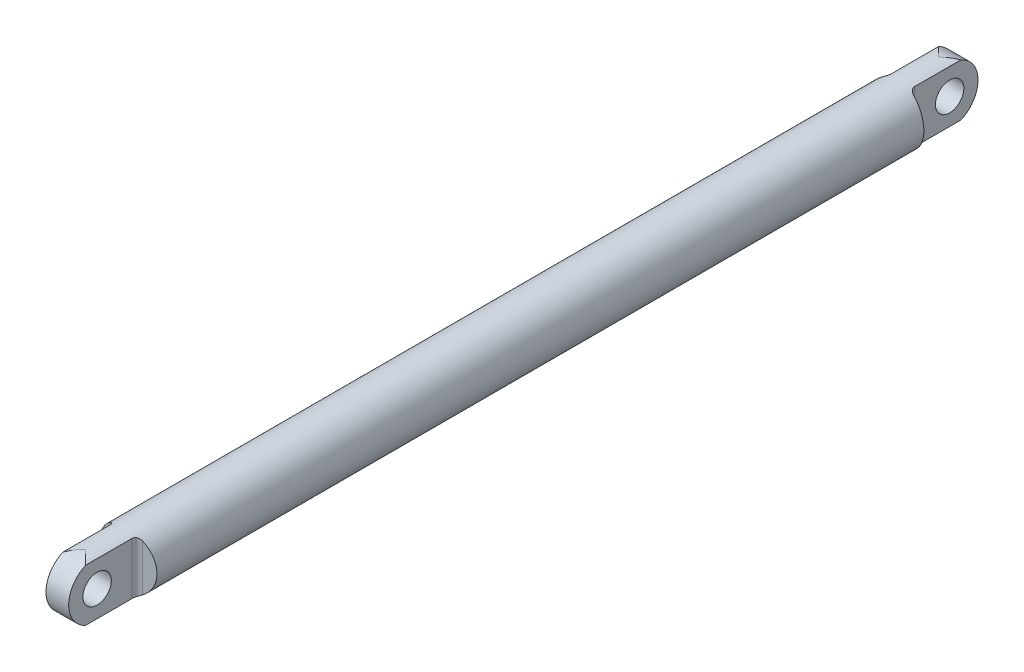
ISO-10303-21;
HEADER;
FILE_DESCRIPTION(('STEP AP214'),'2;1');
FILE_NAME('part.step','',(''),(''),'','','');
FILE_SCHEMA(('AUTOMOTIVE_DESIGN { 1 0 10303 214 1 1 1 1 }'));
ENDSEC;
DATA;
#1=APPLICATION_CONTEXT('core data for automotive mechanical design processes');
#2=APPLICATION_PROTOCOL_DEFINITION('international standard','automotive_design',2000,#1);
#3=PRODUCT_CONTEXT('',#1,'mechanical');
#4=PRODUCT('Part','Part','',(#3));
#5=PRODUCT_RELATED_PRODUCT_CATEGORY('part','',(#4));
#6=PRODUCT_DEFINITION_FORMATION('','',#4);
#7=PRODUCT_DEFINITION_CONTEXT('part definition',#1,'design');
#8=PRODUCT_DEFINITION('design','',#6,#7);
#9=PRODUCT_DEFINITION_SHAPE('','',#8);
#10=(LENGTH_UNIT() NAMED_UNIT(*) SI_UNIT(.MILLI.,.METRE.));
#11=(NAMED_UNIT(*) PLANE_ANGLE_UNIT() SI_UNIT($,.RADIAN.));
#12=(NAMED_UNIT(*) SI_UNIT($,.STERADIAN.) SOLID_ANGLE_UNIT());
#13=UNCERTAINTY_MEASURE_WITH_UNIT(LENGTH_MEASURE(1.E-05),#10,'distance_accuracy_value','');
#14=(GEOMETRIC_REPRESENTATION_CONTEXT(3) GLOBAL_UNCERTAINTY_ASSIGNED_CONTEXT((#13)) GLOBAL_UNIT_ASSIGNED_CONTEXT((#10,
#11,#12)) REPRESENTATION_CONTEXT('',''));
#15=CARTESIAN_POINT('',(0.,0.,0.));
#16=DIRECTION('',(0.,0.,1.));
#17=DIRECTION('',(1.,0.,0.));
#18=AXIS2_PLACEMENT_3D('',#15,#16,#17);
#19=CARTESIAN_POINT('',(0.,0.,80.));
#20=DIRECTION('',(0.,0.,-1.));
#21=DIRECTION('',(-1.,0.,0.));
#22=AXIS2_PLACEMENT_3D('',#19,#20,#21);
#23=CYLINDRICAL_SURFACE('',#22,5.);
#24=CARTESIAN_POINT('',(0.,0.,-75.));
#25=DIRECTION('',(0.707106781186547,0.,-0.707106781186547));
#26=DIRECTION('',(-0.707106781186547,0.,-0.707106781186547));
#27=AXIS2_PLACEMENT_3D('',#24,#25,#26);
#28=ELLIPSE('',#27,7.07106781186548,5.);
#29=CARTESIAN_POINT('',(-2.00000000000001,4.58257569495584,-77.));
#30=VERTEX_POINT('',#29);
#31=CARTESIAN_POINT('',(0.,5.,-75.));
#32=VERTEX_POINT('',#31);
#33=EDGE_CURVE('E262',#30,#32,#28,.T.);
#34=ORIENTED_EDGE('',*,*,#33,.F.);
#35=DIRECTION('',(0.,0.,-1.));
#36=VECTOR('',#35,1.);
#37=CARTESIAN_POINT('',(-1.99999999999999,4.58257569495584,80.));
#38=LINE('',#37,#36);
#39=CARTESIAN_POINT('',(-1.99999999999999,4.58257569495584,-68.8390996311773));
#40=VERTEX_POINT('',#39);
#41=EDGE_CURVE('E253',#30,#40,#38,.F.);
#42=ORIENTED_EDGE('',*,*,#41,.T.);
#43=CARTESIAN_POINT('',(-2.00000000000001,4.58257569495584,-68.8390996311773));
#44=CARTESIAN_POINT('',(-1.99999915444129,4.58257472593018,-68.8129276777542));
#45=CARTESIAN_POINT('',(-2.00102821839981,4.58212708763721,-68.7867686087725));
#46=CARTESIAN_POINT('',(-2.0051266653071,4.58033562986356,-68.7346452838835));
#47=CARTESIAN_POINT('',(-2.00819576753023,4.57899193368756,-68.7086810016689));
#48=CARTESIAN_POINT('',(-2.02040918663705,4.57362335833865,-68.6314818548721));
#49=CARTESIAN_POINT('',(-2.03255988752701,4.56826100508697,-68.5807774510349));
#50=CARTESIAN_POINT('',(-2.06436900142487,4.55397412004701,-68.4823442983605));
#51=CARTESIAN_POINT('',(-2.08402797152572,4.54504932393306,-68.4346157706309));
#52=CARTESIAN_POINT('',(-2.13003060073107,4.52367221490259,-68.3433539562937));
#53=CARTESIAN_POINT('',(-2.15637506815071,4.5112194754162,-68.2998211778551));
#54=CARTESIAN_POINT('',(-2.21528854875706,4.48258714434022,-68.2171193976618));
#55=CARTESIAN_POINT('',(-2.24797505017513,4.46633578752553,-68.1780592935543));
#56=CARTESIAN_POINT('',(-2.31792519070582,4.43043637934986,-68.1060962528812));
#57=CARTESIAN_POINT('',(-2.3551900538286,4.41078741907608,-68.0731949688152));
#58=CARTESIAN_POINT('',(-2.4357720729094,4.36683706502207,-68.0118188589375));
#59=CARTESIAN_POINT('',(-2.47933164249846,4.34230300420189,-67.9838310543528));
#60=CARTESIAN_POINT('',(-2.56870332519188,4.29003983926384,-67.9354587212927));
#61=CARTESIAN_POINT('',(-2.61451640275604,4.26230936019635,-67.9150774809005));
#62=CARTESIAN_POINT('',(-2.68823377653695,4.21597625768681,-67.8884913835967));
#63=CARTESIAN_POINT('',(-2.71585318767789,4.19824162500067,-67.8798909952264));
#64=CARTESIAN_POINT('',(-2.7711147835996,4.16197263460167,-67.86522830102));
#65=CARTESIAN_POINT('',(-2.79875663714262,4.14344090397121,-67.8591582712572));
#66=CARTESIAN_POINT('',(-2.82635182233292,4.12452850352564,-67.8542918781645));
#67=B_SPLINE_CURVE_WITH_KNOTS('',3,(#43,#44,#45,#46,#47,#48,#49,#50,#51,#52,#53,#54,#55,#56,#57,
#58,#59,#60,#61,#62,#63,#64,#65,#66),.UNSPECIFIED.,.F.,.F.,(4,2,2,2,2,2,2,2,2,2,2,4),(0.,
0.0784663817379444,0.156921968106402,0.313349821180226,0.469789283026269,0.626247668323181,
0.785942562576915,0.945680244027676,1.1168798895503,1.28815345391952,1.38985263002429,
1.49123905476497),.UNSPECIFIED.);
#68=CARTESIAN_POINT('',(-2.82635182233307,4.12452850352552,-67.8542918781651));
#69=VERTEX_POINT('',#68);
#70=EDGE_CURVE('E290',#40,#69,#67,.T.);
#71=ORIENTED_EDGE('',*,*,#70,.T.);
#72=CARTESIAN_POINT('',(0.,0.,-68.3526539614169));
#73=DIRECTION('',(0.173648177666934,0.,0.984807753012207));
#74=DIRECTION('',(0.984807753012208,0.,-0.173648177666934));
#75=AXIS2_PLACEMENT_3D('',#72,#73,#74);
#76=ELLIPSE('',#75,5.07713305942873,5.);
#77=CARTESIAN_POINT('',(-2.82635182233307,-4.12452850352553,-67.8542918781651));
#78=VERTEX_POINT('',#77);
#79=EDGE_CURVE('E275',#69,#78,#76,.T.);
#80=ORIENTED_EDGE('',*,*,#79,.T.);
#81=CARTESIAN_POINT('',(-2.82635182233307,-4.12452850352553,-67.8542918781651));
#82=CARTESIAN_POINT('',(-2.79872879714416,-4.14345911096438,-67.8591648493181));
#83=CARTESIAN_POINT('',(-2.77106472198215,-4.16200578901324,-67.8652400496295));
#84=CARTESIAN_POINT('',(-2.71582131156839,-4.19826224817888,-67.8799009977672));
#85=CARTESIAN_POINT('',(-2.68824206549188,-4.21597132333363,-67.8884888210149));
#86=CARTESIAN_POINT('',(-2.60562708818359,-4.26789594594826,-67.9182825523776));
#87=CARTESIAN_POINT('',(-2.55104537825535,-4.30068290114259,-67.9434636570296));
#88=CARTESIAN_POINT('',(-2.44518753710328,-4.3617449826476,-68.0048651632682));
#89=CARTESIAN_POINT('',(-2.393929894614,-4.38999598168069,-68.0411417977512));
#90=CARTESIAN_POINT('',(-2.29786494174254,-4.44103234033674,-68.1242457218313));
#91=CARTESIAN_POINT('',(-2.25303543143821,-4.46383670128808,-68.1710351931477));
#92=CARTESIAN_POINT('',(-2.17769218201057,-4.50102156871438,-68.2672223130545));
#93=CARTESIAN_POINT('',(-2.14607348315317,-4.51611322224303,-68.3154815697644));
#94=CARTESIAN_POINT('',(-2.09126763923946,-4.54175298426806,-68.4177131001897));
#95=CARTESIAN_POINT('',(-2.06808261529536,-4.55229994987521,-68.4716868067176));
#96=CARTESIAN_POINT('',(-2.03342083181656,-4.567879519199,-68.5774243148847));
#97=CARTESIAN_POINT('',(-2.02094462620011,-4.57338725489439,-68.6287895889348));
#98=CARTESIAN_POINT('',(-2.00840913218152,-4.57889846732529,-68.7070040721295));
#99=CARTESIAN_POINT('',(-2.00526038880634,-4.58027713736905,-68.7332975468325));
#100=CARTESIAN_POINT('',(-2.00105489328033,-4.58211544653102,-68.786089733559));
#101=CARTESIAN_POINT('',(-1.99999866322062,-4.5825748562901,-68.8125884951472));
#102=CARTESIAN_POINT('',(-2.00000000000001,-4.58257569495584,-68.8390996311773));
#103=B_SPLINE_CURVE_WITH_KNOTS('',3,(#81,#82,#83,#84,#85,#86,#87,#88,#89,#90,#91,#92,#93,#94,
#95,#96,#97,#98,#99,#100,#101,#102),.UNSPECIFIED.,.F.,.F.,(4,2,2,2,2,2,2,2,2,2,4),(0.,
0.101474679839068,0.203033415339603,0.407351201337666,0.612722140973029,0.817365794656781,
0.995287046442571,1.17325301544067,1.33185526554502,1.411319462848,1.49080348431638),.UNSPECIFIED.);
#104=CARTESIAN_POINT('',(-1.99999999999999,-4.58257569495584,-68.8390996311773));
#105=VERTEX_POINT('',#104);
#106=EDGE_CURVE('E297',#78,#105,#103,.T.);
#107=ORIENTED_EDGE('',*,*,#106,.T.);
#108=DIRECTION('',(0.,0.,-1.));
#109=VECTOR('',#108,1.);
#110=CARTESIAN_POINT('',(-1.99999999999999,-4.58257569495584,80.));
#111=LINE('',#110,#109);
#112=CARTESIAN_POINT('',(-2.00000000000001,-4.58257569495584,-77.));
#113=VERTEX_POINT('',#112);
#114=EDGE_CURVE('E256',#105,#113,#111,.T.);
#115=ORIENTED_EDGE('',*,*,#114,.T.);
#116=CARTESIAN_POINT('',(0.,-5.,-75.));
#117=VERTEX_POINT('',#116);
#118=EDGE_CURVE('E263',#117,#113,#28,.T.);
#119=ORIENTED_EDGE('',*,*,#118,.F.);
#120=CARTESIAN_POINT('',(0.,0.,-75.));
#121=DIRECTION('',(-0.707106781186547,0.,-0.707106781186547));
#122=DIRECTION('',(0.707106781186547,0.,-0.707106781186547));
#123=AXIS2_PLACEMENT_3D('',#120,#121,#122);
#124=ELLIPSE('',#123,7.07106781186548,5.);
#125=CARTESIAN_POINT('',(1.99999999999999,-4.58257569495584,-77.));
#126=VERTEX_POINT('',#125);
#127=EDGE_CURVE('E258',#126,#117,#124,.T.);
#128=ORIENTED_EDGE('',*,*,#127,.F.);
#129=DIRECTION('',(0.,0.,-1.));
#130=VECTOR('',#129,1.);
#131=CARTESIAN_POINT('',(2.,-4.58257569495584,80.));
#132=LINE('',#131,#130);
#133=CARTESIAN_POINT('',(2.,-4.58257569495584,-68.8390996311773));
#134=VERTEX_POINT('',#133);
#135=EDGE_CURVE('E248',#126,#134,#132,.F.);
#136=ORIENTED_EDGE('',*,*,#135,.T.);
#137=CARTESIAN_POINT('',(1.99999999999999,-4.58257569495584,-68.8390996311773));
#138=CARTESIAN_POINT('',(1.99999915444127,-4.58257472593018,-68.8129276777542));
#139=CARTESIAN_POINT('',(2.00102821839979,-4.58212708763722,-68.7867686087726));
#140=CARTESIAN_POINT('',(2.00512666530709,-4.58033562986357,-68.7346452838835));
#141=CARTESIAN_POINT('',(2.00819576753022,-4.57899193368756,-68.7086810016689));
#142=CARTESIAN_POINT('',(2.02040918663704,-4.57362335833865,-68.6314818548721));
#143=CARTESIAN_POINT('',(2.03255988752699,-4.56826100508697,-68.5807774510349));
#144=CARTESIAN_POINT('',(2.06436900142486,-4.55397412004702,-68.4823442983605));
#145=CARTESIAN_POINT('',(2.08402797152571,-4.54504932393306,-68.4346157706309));
#146=CARTESIAN_POINT('',(2.13003060073106,-4.52367221490259,-68.3433539562937));
#147=CARTESIAN_POINT('',(2.1563750681507,-4.51121947541621,-68.2998211778551));
#148=CARTESIAN_POINT('',(2.21528854875704,-4.48258714434023,-68.2171193976618));
#149=CARTESIAN_POINT('',(2.24797505017512,-4.46633578752553,-68.1780592935543));
#150=CARTESIAN_POINT('',(2.31792519070581,-4.43043637934986,-68.1060962528813));
#151=CARTESIAN_POINT('',(2.35519005382859,-4.41078741907609,-68.0731949688152));
#152=CARTESIAN_POINT('',(2.43577207290938,-4.36683706502208,-68.0118188589376));
#153=CARTESIAN_POINT('',(2.47933164249844,-4.34230300420189,-67.9838310543528));
#154=CARTESIAN_POINT('',(2.56870332519187,-4.29003983926385,-67.9354587212927));
#155=CARTESIAN_POINT('',(2.61451640275603,-4.26230936019636,-67.9150774809005));
#156=CARTESIAN_POINT('',(2.68823377653694,-4.21597625768682,-67.8884913835967));
#157=CARTESIAN_POINT('',(2.71585318767788,-4.19824162500067,-67.8798909952264));
#158=CARTESIAN_POINT('',(2.77111478359959,-4.16197263460168,-67.86522830102));
#159=CARTESIAN_POINT('',(2.79875663714262,-4.14344090397122,-67.8591582712572));
#160=CARTESIAN_POINT('',(2.82635182233292,-4.12452850352564,-67.8542918781645));
#161=B_SPLINE_CURVE_WITH_KNOTS('',3,(#137,#138,#139,#140,#141,#142,#143,#144,#145,#146,#147,
#148,#149,#150,#151,#152,#153,#154,#155,#156,#157,#158,#159,#160),.UNSPECIFIED.,.F.,.F.,(4,2,2,
2,2,2,2,2,2,2,2,4),(0.,0.0784663817379581,0.156921968106416,0.313349821180226,0.469789283026285,
0.626247668323181,0.785942562576919,0.945680244027675,1.11687988955031,1.28815345391951,
1.3898526300243,1.49123905476499),.UNSPECIFIED.);
#162=CARTESIAN_POINT('',(2.82635182233308,-4.12452850352553,-67.8542918781651));
#163=VERTEX_POINT('',#162);
#164=EDGE_CURVE('E225',#134,#163,#161,.T.);
#165=ORIENTED_EDGE('',*,*,#164,.T.);
#166=CARTESIAN_POINT('',(0.,0.,-68.3526539614169));
#167=DIRECTION('',(-0.173648177666915,0.,0.984807753012211));
#168=DIRECTION('',(-0.984807753012211,0.,-0.173648177666915));
#169=AXIS2_PLACEMENT_3D('',#166,#167,#168);
#170=ELLIPSE('',#169,5.07713305942871,5.);
#171=CARTESIAN_POINT('',(2.82635182233308,4.12452850352553,-67.8542918781651));
#172=VERTEX_POINT('',#171);
#173=EDGE_CURVE('E272',#163,#172,#170,.T.);
#174=ORIENTED_EDGE('',*,*,#173,.T.);
#175=CARTESIAN_POINT('',(2.82635182233307,4.12452850352553,-67.8542918781651));
#176=CARTESIAN_POINT('',(2.79872879714416,4.14345911096438,-67.8591648493181));
#177=CARTESIAN_POINT('',(2.77106472198215,4.16200578901324,-67.8652400496295));
#178=CARTESIAN_POINT('',(2.71582131156839,4.19826224817888,-67.8799009977672));
#179=CARTESIAN_POINT('',(2.68824206549188,4.21597132333363,-67.8884888210149));
#180=CARTESIAN_POINT('',(2.6056270881836,4.26789594594826,-67.9182825523776));
#181=CARTESIAN_POINT('',(2.55104537825535,4.3006829011426,-67.9434636570296));
#182=CARTESIAN_POINT('',(2.44518753710328,4.36174498264761,-68.0048651632682));
#183=CARTESIAN_POINT('',(2.39392989461399,4.38999598168069,-68.0411417977512));
#184=CARTESIAN_POINT('',(2.29786494174253,4.44103234033675,-68.1242457218313));
#185=CARTESIAN_POINT('',(2.2530354314382,4.46383670128808,-68.1710351931477));
#186=CARTESIAN_POINT('',(2.17769218201056,4.50102156871439,-68.2672223130545));
#187=CARTESIAN_POINT('',(2.14607348315315,4.51611322224304,-68.3154815697644));
#188=CARTESIAN_POINT('',(2.09126763923944,4.54175298426807,-68.4177131001897));
#189=CARTESIAN_POINT('',(2.06808261529534,4.55229994987522,-68.4716868067176));
#190=CARTESIAN_POINT('',(2.03342083181654,4.567879519199,-68.5774243148847));
#191=CARTESIAN_POINT('',(2.02094462620009,4.5733872548944,-68.6287895889348));
#192=CARTESIAN_POINT('',(2.00840913218151,4.5788984673253,-68.7070040721295));
#193=CARTESIAN_POINT('',(2.00526038880633,4.58027713736906,-68.7332975468326));
#194=CARTESIAN_POINT('',(2.00105489328031,4.58211544653103,-68.786089733559));
#195=CARTESIAN_POINT('',(1.9999986632206,4.58257485629011,-68.8125884951472));
#196=CARTESIAN_POINT('',(1.99999999999999,4.58257569495584,-68.8390996311773));
#197=B_SPLINE_CURVE_WITH_KNOTS('',3,(#175,#176,#177,#178,#179,#180,#181,#182,#183,#184,#185,
#186,#187,#188,#189,#190,#191,#192,#193,#194,#195,#196),.UNSPECIFIED.,.F.,.F.,(4,2,2,2,2,2,2,2,
2,2,4),(0.,0.101474679839068,0.203033415339603,0.407351201337675,0.61272214097303,
0.8173657946568,0.99528704644259,1.17325301544069,1.33185526554504,1.41131946284802,
1.4908034843164),.UNSPECIFIED.);
#198=CARTESIAN_POINT('',(2.,4.58257569495584,-68.8390996311773));
#199=VERTEX_POINT('',#198);
#200=EDGE_CURVE('E320',#172,#199,#197,.T.);
#201=ORIENTED_EDGE('',*,*,#200,.T.);
#202=DIRECTION('',(0.,0.,-1.));
#203=VECTOR('',#202,1.);
#204=CARTESIAN_POINT('',(2.,4.58257569495584,80.));
#205=LINE('',#204,#203);
#206=CARTESIAN_POINT('',(1.99999999999999,4.58257569495584,-77.));
#207=VERTEX_POINT('',#206);
#208=EDGE_CURVE('E251',#199,#207,#205,.T.);
#209=ORIENTED_EDGE('',*,*,#208,.T.);
#210=EDGE_CURVE('E259',#32,#207,#124,.T.);
#211=ORIENTED_EDGE('',*,*,#210,.F.);
#212=EDGE_LOOP('',(#34,#42,#71,#80,#107,#115,#119,#128,#136,#165,#174,#201,#209,#211));
#213=FACE_BOUND('',#212,.T.);
#214=CARTESIAN_POINT('',(0.,0.,68.3526539614169));
#215=DIRECTION('',(-0.173648177666934,0.,0.984807753012207));
#216=DIRECTION('',(-0.984807753012208,0.,-0.173648177666934));
#217=AXIS2_PLACEMENT_3D('',#214,#215,#216);
#218=ELLIPSE('',#217,5.07713305942873,5.);
#219=CARTESIAN_POINT('',(-2.82635182233307,4.12452850352553,67.8542918781651));
#220=VERTEX_POINT('',#219);
#221=CARTESIAN_POINT('',(-2.82635182233307,-4.12452850352552,67.8542918781651));
#222=VERTEX_POINT('',#221);
#223=EDGE_CURVE('E334',#220,#222,#218,.T.);
#224=ORIENTED_EDGE('',*,*,#223,.F.);
#225=CARTESIAN_POINT('',(-2.82635182233307,4.12452850352553,67.8542918781651));
#226=CARTESIAN_POINT('',(-2.79872879714416,4.14345911096438,67.8591648493181));
#227=CARTESIAN_POINT('',(-2.77106472198215,4.16200578901324,67.8652400496295));
#228=CARTESIAN_POINT('',(-2.71582131156839,4.19826224817888,67.8799009977672));
#229=CARTESIAN_POINT('',(-2.68824206549188,4.21597132333363,67.8884888210149));
#230=CARTESIAN_POINT('',(-2.60562708818359,4.26789594594826,67.9182825523776));
#231=CARTESIAN_POINT('',(-2.55104537825535,4.30068290114259,67.9434636570296));
#232=CARTESIAN_POINT('',(-2.44518753710328,4.3617449826476,68.0048651632682));
#233=CARTESIAN_POINT('',(-2.393929894614,4.38999598168069,68.0411417977512));
#234=CARTESIAN_POINT('',(-2.29786494174254,4.44103234033674,68.1242457218313));
#235=CARTESIAN_POINT('',(-2.25303543143821,4.46383670128808,68.1710351931477));
#236=CARTESIAN_POINT('',(-2.17769218201057,4.50102156871438,68.2672223130545));
#237=CARTESIAN_POINT('',(-2.14607348315317,4.51611322224303,68.3154815697644));
#238=CARTESIAN_POINT('',(-2.09126763923946,4.54175298426806,68.4177131001897));
#239=CARTESIAN_POINT('',(-2.06808261529536,4.55229994987521,68.4716868067176));
#240=CARTESIAN_POINT('',(-2.03342083181656,4.567879519199,68.5774243148847));
#241=CARTESIAN_POINT('',(-2.02094462620011,4.57338725489439,68.6287895889348));
#242=CARTESIAN_POINT('',(-2.00840913218152,4.57889846732529,68.7070040721295));
#243=CARTESIAN_POINT('',(-2.00526038880634,4.58027713736905,68.7332975468325));
#244=CARTESIAN_POINT('',(-2.00105489328033,4.58211544653102,68.786089733559));
#245=CARTESIAN_POINT('',(-1.99999866322062,4.5825748562901,68.8125884951472));
#246=CARTESIAN_POINT('',(-2.00000000000001,4.58257569495584,68.8390996311773));
#247=B_SPLINE_CURVE_WITH_KNOTS('',3,(#225,#226,#227,#228,#229,#230,#231,#232,#233,#234,#235,
#236,#237,#238,#239,#240,#241,#242,#243,#244,#245,#246),.UNSPECIFIED.,.F.,.F.,(4,2,2,2,2,2,2,2,
2,2,4),(0.,0.101474679839068,0.203033415339603,0.407351201337666,0.612722140973029,
0.817365794656781,0.995287046442571,1.17325301544067,1.33185526554502,1.411319462848,
1.49080348431638),.UNSPECIFIED.);
#248=CARTESIAN_POINT('',(-2.00000000000001,4.58257569495584,68.8390996311773));
#249=VERTEX_POINT('',#248);
#250=EDGE_CURVE('E349',#220,#249,#247,.T.);
#251=ORIENTED_EDGE('',*,*,#250,.T.);
#252=DIRECTION('',(0.,0.,-1.));
#253=VECTOR('',#252,1.);
#254=CARTESIAN_POINT('',(-2.00000000000001,4.58257569495584,80.));
#255=LINE('',#254,#253);
#256=CARTESIAN_POINT('',(-2.00000000000001,4.58257569495584,77.));
#257=VERTEX_POINT('',#256);
#258=EDGE_CURVE('E373',#257,#249,#255,.T.);
#259=ORIENTED_EDGE('',*,*,#258,.F.);
#260=CARTESIAN_POINT('',(0.,0.,75.));
#261=DIRECTION('',(-0.707106781186547,0.,-0.707106781186547));
#262=DIRECTION('',(0.707106781186547,0.,-0.707106781186547));
#263=AXIS2_PLACEMENT_3D('',#260,#261,#262);
#264=ELLIPSE('',#263,7.07106781186548,5.);
#265=CARTESIAN_POINT('',(0.,5.,75.));
#266=VERTEX_POINT('',#265);
#267=EDGE_CURVE('E241',#257,#266,#264,.T.);
#268=ORIENTED_EDGE('',*,*,#267,.T.);
#269=CARTESIAN_POINT('',(0.,0.,75.));
#270=DIRECTION('',(0.707106781186547,0.,-0.707106781186547));
#271=DIRECTION('',(-0.707106781186547,0.,-0.707106781186547));
#272=AXIS2_PLACEMENT_3D('',#269,#270,#271);
#273=ELLIPSE('',#272,7.07106781186548,5.);
#274=CARTESIAN_POINT('',(1.99999999999999,4.58257569495584,77.));
#275=VERTEX_POINT('',#274);
#276=EDGE_CURVE('E238',#266,#275,#273,.T.);
#277=ORIENTED_EDGE('',*,*,#276,.T.);
#278=DIRECTION('',(0.,0.,-1.));
#279=VECTOR('',#278,1.);
#280=CARTESIAN_POINT('',(1.99999999999999,4.58257569495584,80.));
#281=LINE('',#280,#279);
#282=CARTESIAN_POINT('',(1.99999999999999,4.58257569495584,68.8390996311773));
#283=VERTEX_POINT('',#282);
#284=EDGE_CURVE('E219',#283,#275,#281,.F.);
#285=ORIENTED_EDGE('',*,*,#284,.F.);
#286=CARTESIAN_POINT('',(1.99999999999999,4.58257569495584,68.8390996311773));
#287=CARTESIAN_POINT('',(1.99999915444127,4.58257472593018,68.8129276777542));
#288=CARTESIAN_POINT('',(2.00102821839979,4.58212708763722,68.7867686087726));
#289=CARTESIAN_POINT('',(2.00512666530709,4.58033562986357,68.7346452838835));
#290=CARTESIAN_POINT('',(2.00819576753022,4.57899193368756,68.7086810016689));
#291=CARTESIAN_POINT('',(2.02040918663704,4.57362335833866,68.6314818548721));
#292=CARTESIAN_POINT('',(2.03255988752699,4.56826100508697,68.5807774510349));
#293=CARTESIAN_POINT('',(2.06436900142486,4.55397412004702,68.4823442983605));
#294=CARTESIAN_POINT('',(2.08402797152571,4.54504932393306,68.4346157706309));
#295=CARTESIAN_POINT('',(2.13003060073106,4.52367221490259,68.3433539562937));
#296=CARTESIAN_POINT('',(2.1563750681507,4.51121947541621,68.2998211778551));
#297=CARTESIAN_POINT('',(2.21528854875704,4.48258714434023,68.2171193976618));
#298=CARTESIAN_POINT('',(2.24797505017512,4.46633578752553,68.1780592935543));
#299=CARTESIAN_POINT('',(2.31792519070581,4.43043637934986,68.1060962528813));
#300=CARTESIAN_POINT('',(2.35519005382859,4.41078741907609,68.0731949688152));
#301=CARTESIAN_POINT('',(2.43577207290938,4.36683706502208,68.0118188589376));
#302=CARTESIAN_POINT('',(2.47933164249844,4.34230300420189,67.9838310543528));
#303=CARTESIAN_POINT('',(2.56870332519187,4.29003983926385,67.9354587212927));
#304=CARTESIAN_POINT('',(2.61451640275603,4.26230936019636,67.9150774809005));
#305=CARTESIAN_POINT('',(2.68823377653694,4.21597625768682,67.8884913835967));
#306=CARTESIAN_POINT('',(2.71585318767788,4.19824162500067,67.8798909952264));
#307=CARTESIAN_POINT('',(2.77111478359959,4.16197263460168,67.86522830102));
#308=CARTESIAN_POINT('',(2.79875663714262,4.14344090397122,67.8591582712572));
#309=CARTESIAN_POINT('',(2.82635182233292,4.12452850352564,67.8542918781645));
#310=B_SPLINE_CURVE_WITH_KNOTS('',3,(#286,#287,#288,#289,#290,#291,#292,#293,#294,#295,#296,
#297,#298,#299,#300,#301,#302,#303,#304,#305,#306,#307,#308,#309),.UNSPECIFIED.,.F.,.F.,(4,2,2,
2,2,2,2,2,2,2,2,4),(0.,0.0784663817379582,0.156921968106416,0.313349821180226,0.469789283026285,
0.626247668323181,0.785942562576919,0.945680244027675,1.11687988955031,1.28815345391951,
1.3898526300243,1.49123905476499),.UNSPECIFIED.);
#311=CARTESIAN_POINT('',(2.82635182233308,4.12452850352553,67.8542918781651));
#312=VERTEX_POINT('',#311);
#313=EDGE_CURVE('E122',#283,#312,#310,.T.);
#314=ORIENTED_EDGE('',*,*,#313,.T.);
#315=CARTESIAN_POINT('',(0.,0.,68.3526539614169));
#316=DIRECTION('',(0.173648177666915,0.,0.984807753012211));
#317=DIRECTION('',(0.984807753012211,0.,-0.173648177666915));
#318=AXIS2_PLACEMENT_3D('',#315,#316,#317);
#319=ELLIPSE('',#318,5.07713305942871,5.);
#320=CARTESIAN_POINT('',(2.82635182233308,-4.12452850352553,67.8542918781651));
#321=VERTEX_POINT('',#320);
#322=EDGE_CURVE('E332',#321,#312,#319,.T.);
#323=ORIENTED_EDGE('',*,*,#322,.F.);
#324=CARTESIAN_POINT('',(2.82635182233307,-4.12452850352553,67.8542918781651));
#325=CARTESIAN_POINT('',(2.79872879714416,-4.14345911096438,67.8591648493181));
#326=CARTESIAN_POINT('',(2.77106472198215,-4.16200578901324,67.8652400496295));
#327=CARTESIAN_POINT('',(2.71582131156839,-4.19826224817888,67.8799009977672));
#328=CARTESIAN_POINT('',(2.68824206549188,-4.21597132333363,67.8884888210149));
#329=CARTESIAN_POINT('',(2.6056270881836,-4.26789594594826,67.9182825523776));
#330=CARTESIAN_POINT('',(2.55104537825535,-4.3006829011426,67.9434636570296));
#331=CARTESIAN_POINT('',(2.44518753710328,-4.36174498264761,68.0048651632682));
#332=CARTESIAN_POINT('',(2.39392989461399,-4.38999598168069,68.0411417977512));
#333=CARTESIAN_POINT('',(2.29786494174253,-4.44103234033675,68.1242457218313));
#334=CARTESIAN_POINT('',(2.2530354314382,-4.46383670128808,68.1710351931477));
#335=CARTESIAN_POINT('',(2.17769218201056,-4.50102156871439,68.2672223130545));
#336=CARTESIAN_POINT('',(2.14607348315315,-4.51611322224304,68.3154815697644));
#337=CARTESIAN_POINT('',(2.09126763923944,-4.54175298426807,68.4177131001897));
#338=CARTESIAN_POINT('',(2.06808261529534,-4.55229994987522,68.4716868067176));
#339=CARTESIAN_POINT('',(2.03342083181654,-4.567879519199,68.5774243148847));
#340=CARTESIAN_POINT('',(2.02094462620009,-4.5733872548944,68.6287895889348));
#341=CARTESIAN_POINT('',(2.00840913218151,-4.5788984673253,68.7070040721295));
#342=CARTESIAN_POINT('',(2.00526038880633,-4.58027713736906,68.7332975468326));
#343=CARTESIAN_POINT('',(2.00105489328031,-4.58211544653103,68.786089733559));
#344=CARTESIAN_POINT('',(1.9999986632206,-4.58257485629011,68.8125884951472));
#345=CARTESIAN_POINT('',(1.99999999999999,-4.58257569495584,68.8390996311773));
#346=B_SPLINE_CURVE_WITH_KNOTS('',3,(#324,#325,#326,#327,#328,#329,#330,#331,#332,#333,#334,
#335,#336,#337,#338,#339,#340,#341,#342,#343,#344,#345),.UNSPECIFIED.,.F.,.F.,(4,2,2,2,2,2,2,2,
2,2,4),(0.,0.101474679839069,0.203033415339603,0.407351201337676,0.612722140973031,
0.817365794656801,0.995287046442591,1.17325301544069,1.33185526554504,1.41131946284802,
1.4908034843164),.UNSPECIFIED.);
#347=CARTESIAN_POINT('',(1.99999999999999,-4.58257569495584,68.8390996311773));
#348=VERTEX_POINT('',#347);
#349=EDGE_CURVE('E12',#321,#348,#346,.T.);
#350=ORIENTED_EDGE('',*,*,#349,.T.);
#351=DIRECTION('',(0.,0.,-1.));
#352=VECTOR('',#351,1.);
#353=CARTESIAN_POINT('',(1.99999999999999,-4.58257569495584,80.));
#354=LINE('',#353,#352);
#355=CARTESIAN_POINT('',(1.99999999999999,-4.58257569495584,77.));
#356=VERTEX_POINT('',#355);
#357=EDGE_CURVE('E217',#356,#348,#354,.T.);
#358=ORIENTED_EDGE('',*,*,#357,.F.);
#359=CARTESIAN_POINT('',(0.,-5.,75.));
#360=VERTEX_POINT('',#359);
#361=EDGE_CURVE('E229',#356,#360,#273,.T.);
#362=ORIENTED_EDGE('',*,*,#361,.T.);
#363=CARTESIAN_POINT('',(-2.00000000000001,-4.58257569495584,77.));
#364=VERTEX_POINT('',#363);
#365=EDGE_CURVE('E237',#360,#364,#264,.T.);
#366=ORIENTED_EDGE('',*,*,#365,.T.);
#367=DIRECTION('',(0.,0.,-1.));
#368=VECTOR('',#367,1.);
#369=CARTESIAN_POINT('',(-2.00000000000001,-4.58257569495584,80.));
#370=LINE('',#369,#368);
#371=CARTESIAN_POINT('',(-2.00000000000001,-4.58257569495584,68.8390996311773));
#372=VERTEX_POINT('',#371);
#373=EDGE_CURVE('E232',#372,#364,#370,.F.);
#374=ORIENTED_EDGE('',*,*,#373,.F.);
#375=CARTESIAN_POINT('',(-2.00000000000001,-4.58257569495584,68.8390996311773));
#376=CARTESIAN_POINT('',(-1.99999915444129,-4.58257472593018,68.8129276777542));
#377=CARTESIAN_POINT('',(-2.00102821839981,-4.58212708763721,68.7867686087725));
#378=CARTESIAN_POINT('',(-2.0051266653071,-4.58033562986356,68.7346452838835));
#379=CARTESIAN_POINT('',(-2.00819576753023,-4.57899193368756,68.7086810016689));
#380=CARTESIAN_POINT('',(-2.02040918663705,-4.57362335833865,68.6314818548721));
#381=CARTESIAN_POINT('',(-2.03255988752701,-4.56826100508697,68.5807774510349));
#382=CARTESIAN_POINT('',(-2.06436900142487,-4.55397412004701,68.4823442983605));
#383=CARTESIAN_POINT('',(-2.08402797152572,-4.54504932393306,68.4346157706309));
#384=CARTESIAN_POINT('',(-2.13003060073107,-4.52367221490259,68.3433539562937));
#385=CARTESIAN_POINT('',(-2.15637506815071,-4.5112194754162,68.2998211778551));
#386=CARTESIAN_POINT('',(-2.21528854875706,-4.48258714434022,68.2171193976618));
#387=CARTESIAN_POINT('',(-2.24797505017513,-4.46633578752553,68.1780592935543));
#388=CARTESIAN_POINT('',(-2.31792519070582,-4.43043637934986,68.1060962528812));
#389=CARTESIAN_POINT('',(-2.3551900538286,-4.41078741907608,68.0731949688152));
#390=CARTESIAN_POINT('',(-2.4357720729094,-4.36683706502207,68.0118188589375));
#391=CARTESIAN_POINT('',(-2.47933164249846,-4.34230300420189,67.9838310543528));
#392=CARTESIAN_POINT('',(-2.56870332519188,-4.29003983926384,67.9354587212927));
#393=CARTESIAN_POINT('',(-2.61451640275604,-4.26230936019635,67.9150774809005));
#394=CARTESIAN_POINT('',(-2.68823377653695,-4.21597625768681,67.8884913835967));
#395=CARTESIAN_POINT('',(-2.71585318767789,-4.19824162500067,67.8798909952264));
#396=CARTESIAN_POINT('',(-2.7711147835996,-4.16197263460167,67.86522830102));
#397=CARTESIAN_POINT('',(-2.79875663714262,-4.14344090397121,67.8591582712572));
#398=CARTESIAN_POINT('',(-2.82635182233292,-4.12452850352564,67.8542918781645));
#399=B_SPLINE_CURVE_WITH_KNOTS('',3,(#375,#376,#377,#378,#379,#380,#381,#382,#383,#384,#385,
#386,#387,#388,#389,#390,#391,#392,#393,#394,#395,#396,#397,#398),.UNSPECIFIED.,.F.,.F.,(4,2,2,
2,2,2,2,2,2,2,2,4),(0.,0.0784663817379443,0.156921968106402,0.313349821180226,0.469789283026269,
0.626247668323181,0.785942562576915,0.945680244027675,1.1168798895503,1.28815345391952,
1.38985263002429,1.49123905476497),.UNSPECIFIED.);
#400=EDGE_CURVE('E355',#372,#222,#399,.T.);
#401=ORIENTED_EDGE('',*,*,#400,.T.);
#402=EDGE_LOOP('',(#224,#251,#259,#268,#277,#285,#314,#323,#350,#358,#362,#366,#374,#401));
#403=FACE_BOUND('',#402,.T.);
#404=ADVANCED_FACE('F108',(#213,#403),#23,.T.);
#405=CARTESIAN_POINT('',(-5.,0.,75.));
#406=DIRECTION('',(1.,0.,0.));
#407=DIRECTION('',(0.,0.,-1.));
#408=AXIS2_PLACEMENT_3D('',#405,#406,#407);
#409=CYLINDRICAL_SURFACE('',#408,5.);
#410=ORIENTED_EDGE('',*,*,#267,.F.);
#411=CARTESIAN_POINT('',(-2.00000000000001,0.,75.));
#412=DIRECTION('',(-1.,0.,0.));
#413=DIRECTION('',(0.,0.,1.));
#414=AXIS2_PLACEMENT_3D('',#411,#412,#413);
#415=CIRCLE('',#414,5.);
#416=EDGE_CURVE('E224',#364,#257,#415,.T.);
#417=ORIENTED_EDGE('',*,*,#416,.F.);
#418=ORIENTED_EDGE('',*,*,#365,.F.);
#419=ORIENTED_EDGE('',*,*,#361,.F.);
#420=CARTESIAN_POINT('',(1.99999999999999,0.,75.));
#421=DIRECTION('',(1.,0.,0.));
#422=DIRECTION('',(0.,0.,-1.));
#423=AXIS2_PLACEMENT_3D('',#420,#421,#422);
#424=CIRCLE('',#423,5.);
#425=EDGE_CURVE('E213',#275,#356,#424,.T.);
#426=ORIENTED_EDGE('',*,*,#425,.F.);
#427=ORIENTED_EDGE('',*,*,#276,.F.);
#428=EDGE_LOOP('',(#410,#417,#418,#419,#426,#427));
#429=FACE_BOUND('',#428,.T.);
#430=ADVANCED_FACE('F235',(#429),#409,.T.);
#431=CARTESIAN_POINT('',(-5.,0.,-75.));
#432=DIRECTION('',(1.,0.,0.));
#433=DIRECTION('',(0.,0.,-1.));
#434=AXIS2_PLACEMENT_3D('',#431,#432,#433);
#435=CYLINDRICAL_SURFACE('',#434,5.);
#436=ORIENTED_EDGE('',*,*,#118,.T.);
#437=CARTESIAN_POINT('',(-2.00000000000001,0.,-75.));
#438=DIRECTION('',(1.,0.,0.));
#439=DIRECTION('',(0.,0.,-1.));
#440=AXIS2_PLACEMENT_3D('',#437,#438,#439);
#441=CIRCLE('',#440,5.);
#442=EDGE_CURVE('E269',#30,#113,#441,.F.);
#443=ORIENTED_EDGE('',*,*,#442,.F.);
#444=ORIENTED_EDGE('',*,*,#33,.T.);
#445=ORIENTED_EDGE('',*,*,#210,.T.);
#446=CARTESIAN_POINT('',(1.99999999999999,0.,-75.));
#447=DIRECTION('',(-1.,0.,0.));
#448=DIRECTION('',(0.,0.,1.));
#449=AXIS2_PLACEMENT_3D('',#446,#447,#448);
#450=CIRCLE('',#449,5.);
#451=EDGE_CURVE('E266',#126,#207,#450,.F.);
#452=ORIENTED_EDGE('',*,*,#451,.F.);
#453=ORIENTED_EDGE('',*,*,#127,.T.);
#454=EDGE_LOOP('',(#436,#443,#444,#445,#452,#453));
#455=FACE_BOUND('',#454,.T.);
#456=ADVANCED_FACE('F401',(#455),#435,.T.);
#457=CARTESIAN_POINT('',(1.99999999999999,-5.,-68.));
#458=DIRECTION('',(-0.173648177666915,0.,0.984807753012211));
#459=DIRECTION('',(0.984807753012211,0.,0.173648177666915));
#460=AXIS2_PLACEMENT_3D('',#457,#458,#459);
#461=PLANE('',#460);
#462=ORIENTED_EDGE('',*,*,#173,.F.);
#463=DIRECTION('',(0.,1.,0.));
#464=VECTOR('',#463,1.);
#465=CARTESIAN_POINT('',(2.82635182233308,4.58257569495584,-67.8542918781651));
#466=LINE('',#465,#464);
#467=EDGE_CURVE('E285',#163,#172,#466,.T.);
#468=ORIENTED_EDGE('',*,*,#467,.T.);
#469=EDGE_LOOP('',(#462,#468));
#470=FACE_BOUND('',#469,.T.);
#471=ADVANCED_FACE('F426',(#470),#461,.F.);
#472=CARTESIAN_POINT('',(1.99999999999999,-5.,-80.));
#473=DIRECTION('',(-1.,0.,0.));
#474=DIRECTION('',(0.,0.,1.));
#475=AXIS2_PLACEMENT_3D('',#472,#473,#474);
#476=PLANE('',#475);
#477=CARTESIAN_POINT('',(1.99999999999999,0.,-75.));
#478=DIRECTION('',(-1.,0.,0.));
#479=DIRECTION('',(0.,0.,1.));
#480=AXIS2_PLACEMENT_3D('',#477,#478,#479);
#481=CIRCLE('',#480,2.50000000000001);
#482=CARTESIAN_POINT('',(1.99999999999999,0.,-77.5));
#483=VERTEX_POINT('',#482);
#484=EDGE_CURVE('E245',#483,#483,#481,.T.);
#485=ORIENTED_EDGE('',*,*,#484,.T.);
#486=EDGE_LOOP('',(#485));
#487=FACE_BOUND('',#486,.T.);
#488=ORIENTED_EDGE('',*,*,#208,.F.);
#489=DIRECTION('',(0.,1.,0.));
#490=VECTOR('',#489,1.);
#491=CARTESIAN_POINT('',(1.99999999999999,-4.58257569495584,-68.8390996311773));
#492=LINE('',#491,#490);
#493=EDGE_CURVE('E288',#199,#134,#492,.F.);
#494=ORIENTED_EDGE('',*,*,#493,.T.);
#495=ORIENTED_EDGE('',*,*,#135,.F.);
#496=ORIENTED_EDGE('',*,*,#451,.T.);
#497=EDGE_LOOP('',(#488,#494,#495,#496));
#498=FACE_BOUND('',#497,.T.);
#499=ADVANCED_FACE('F418',(#487,#498),#476,.F.);
#500=CARTESIAN_POINT('',(-5.,-5.,-67.4710190578746));
#501=DIRECTION('',(0.173648177666934,0.,0.984807753012207));
#502=DIRECTION('',(0.984807753012208,0.,-0.173648177666934));
#503=AXIS2_PLACEMENT_3D('',#500,#501,#502);
#504=PLANE('',#503);
#505=ORIENTED_EDGE('',*,*,#79,.F.);
#506=DIRECTION('',(0.,1.,0.));
#507=VECTOR('',#506,1.);
#508=CARTESIAN_POINT('',(-2.82635182233307,-4.58257569495584,-67.8542918781651));
#509=LINE('',#508,#507);
#510=EDGE_CURVE('E283',#69,#78,#509,.F.);
#511=ORIENTED_EDGE('',*,*,#510,.T.);
#512=EDGE_LOOP('',(#505,#511));
#513=FACE_BOUND('',#512,.T.);
#514=ADVANCED_FACE('F416',(#513),#504,.F.);
#515=CARTESIAN_POINT('',(-2.00000000000001,-5.,-80.));
#516=DIRECTION('',(1.,0.,0.));
#517=DIRECTION('',(0.,0.,-1.));
#518=AXIS2_PLACEMENT_3D('',#515,#516,#517);
#519=PLANE('',#518);
#520=CARTESIAN_POINT('',(-2.00000000000001,0.,-75.));
#521=DIRECTION('',(1.,0.,0.));
#522=DIRECTION('',(0.,0.,-1.));
#523=AXIS2_PLACEMENT_3D('',#520,#521,#522);
#524=CIRCLE('',#523,2.50000000000001);
#525=CARTESIAN_POINT('',(-2.00000000000001,0.,-77.5));
#526=VERTEX_POINT('',#525);
#527=EDGE_CURVE('E240',#526,#526,#524,.T.);
#528=ORIENTED_EDGE('',*,*,#527,.T.);
#529=EDGE_LOOP('',(#528));
#530=FACE_BOUND('',#529,.T.);
#531=ORIENTED_EDGE('',*,*,#114,.F.);
#532=DIRECTION('',(0.,1.,0.));
#533=VECTOR('',#532,1.);
#534=CARTESIAN_POINT('',(-2.00000000000001,4.58257569495583,-68.8390996311773));
#535=LINE('',#534,#533);
#536=EDGE_CURVE('E278',#105,#40,#535,.T.);
#537=ORIENTED_EDGE('',*,*,#536,.T.);
#538=ORIENTED_EDGE('',*,*,#41,.F.);
#539=ORIENTED_EDGE('',*,*,#442,.T.);
#540=EDGE_LOOP('',(#531,#537,#538,#539));
#541=FACE_BOUND('',#540,.T.);
#542=ADVANCED_FACE('F410',(#530,#541),#519,.F.);
#543=CARTESIAN_POINT('',(-5.00000000000002,0.,-75.));
#544=DIRECTION('',(1.,0.,0.));
#545=DIRECTION('',(0.,0.,-1.));
#546=AXIS2_PLACEMENT_3D('',#543,#544,#545);
#547=CYLINDRICAL_SURFACE('',#546,2.50000000000001);
#548=CARTESIAN_POINT('',(-2.00000000000001,0.,-77.5));
#549=CARTESIAN_POINT('',(-1.95833333333334,0.,-77.5));
#550=CARTESIAN_POINT('',(-1.91666666666668,0.,-77.5));
#551=CARTESIAN_POINT('',(-1.83333333333334,0.,-77.5));
#552=CARTESIAN_POINT('',(-1.79166666666668,0.,-77.5));
#553=CARTESIAN_POINT('',(-1.70833333333334,0.,-77.5));
#554=CARTESIAN_POINT('',(-1.66666666666668,0.,-77.5));
#555=CARTESIAN_POINT('',(-1.58333333333334,0.,-77.5));
#556=CARTESIAN_POINT('',(-1.54166666666668,0.,-77.5));
#557=CARTESIAN_POINT('',(-1.45833333333334,0.,-77.5));
#558=CARTESIAN_POINT('',(-1.41666666666668,0.,-77.5));
#559=CARTESIAN_POINT('',(-1.33333333333334,0.,-77.5));
#560=CARTESIAN_POINT('',(-1.29166666666668,0.,-77.5));
#561=CARTESIAN_POINT('',(-1.20833333333334,0.,-77.5));
#562=CARTESIAN_POINT('',(-1.16666666666668,0.,-77.5));
#563=CARTESIAN_POINT('',(-1.08333333333334,0.,-77.5));
#564=CARTESIAN_POINT('',(-1.04166666666668,0.,-77.5));
#565=CARTESIAN_POINT('',(-0.958333333333343,0.,-77.5));
#566=CARTESIAN_POINT('',(-0.916666666666676,0.,-77.5));
#567=CARTESIAN_POINT('',(-0.833333333333343,0.,-77.5));
#568=CARTESIAN_POINT('',(-0.791666666666676,0.,-77.5));
#569=CARTESIAN_POINT('',(-0.708333333333343,0.,-77.5));
#570=CARTESIAN_POINT('',(-0.666666666666677,0.,-77.5));
#571=CARTESIAN_POINT('',(-0.583333333333343,0.,-77.5));
#572=CARTESIAN_POINT('',(-0.541666666666677,0.,-77.5));
#573=CARTESIAN_POINT('',(-0.458333333333343,0.,-77.5));
#574=CARTESIAN_POINT('',(-0.416666666666677,0.,-77.5));
#575=CARTESIAN_POINT('',(-0.333333333333343,0.,-77.5));
#576=CARTESIAN_POINT('',(-0.291666666666676,0.,-77.5));
#577=CARTESIAN_POINT('',(-0.208333333333343,0.,-77.5));
#578=CARTESIAN_POINT('',(-0.166666666666676,0.,-77.5));
#579=CARTESIAN_POINT('',(-0.0833333333333429,0.,-77.5));
#580=CARTESIAN_POINT('',(-0.0416666666666762,0.,-77.5));
#581=CARTESIAN_POINT('',(0.0416666666666572,0.,-77.5));
#582=CARTESIAN_POINT('',(0.0833333333333239,0.,-77.5));
#583=CARTESIAN_POINT('',(0.166666666666657,0.,-77.5));
#584=CARTESIAN_POINT('',(0.208333333333324,0.,-77.5));
#585=CARTESIAN_POINT('',(0.291666666666657,0.,-77.5));
#586=CARTESIAN_POINT('',(0.333333333333324,0.,-77.5));
#587=CARTESIAN_POINT('',(0.416666666666657,0.,-77.5));
#588=CARTESIAN_POINT('',(0.458333333333324,0.,-77.5));
#589=CARTESIAN_POINT('',(0.541666666666658,0.,-77.5));
#590=CARTESIAN_POINT('',(0.583333333333324,0.,-77.5));
#591=CARTESIAN_POINT('',(0.666666666666657,0.,-77.5));
#592=CARTESIAN_POINT('',(0.708333333333324,0.,-77.5));
#593=CARTESIAN_POINT('',(0.791666666666657,0.,-77.5));
#594=CARTESIAN_POINT('',(0.833333333333324,0.,-77.5));
#595=CARTESIAN_POINT('',(0.916666666666657,0.,-77.5));
#596=CARTESIAN_POINT('',(0.958333333333324,0.,-77.5));
#597=CARTESIAN_POINT('',(1.04166666666666,0.,-77.5));
#598=CARTESIAN_POINT('',(1.08333333333332,0.,-77.5));
#599=CARTESIAN_POINT('',(1.16666666666666,0.,-77.5));
#600=CARTESIAN_POINT('',(1.20833333333332,0.,-77.5));
#601=CARTESIAN_POINT('',(1.29166666666666,0.,-77.5));
#602=CARTESIAN_POINT('',(1.33333333333332,0.,-77.5));
#603=CARTESIAN_POINT('',(1.41666666666666,0.,-77.5));
#604=CARTESIAN_POINT('',(1.45833333333332,0.,-77.5));
#605=CARTESIAN_POINT('',(1.54166666666666,0.,-77.5));
#606=CARTESIAN_POINT('',(1.58333333333332,0.,-77.5));
#607=CARTESIAN_POINT('',(1.66666666666666,0.,-77.5));
#608=CARTESIAN_POINT('',(1.70833333333332,0.,-77.5));
#609=CARTESIAN_POINT('',(1.79166666666666,0.,-77.5));
#610=CARTESIAN_POINT('',(1.83333333333332,0.,-77.5));
#611=CARTESIAN_POINT('',(1.91666666666666,0.,-77.5));
#612=CARTESIAN_POINT('',(1.95833333333332,0.,-77.5));
#613=CARTESIAN_POINT('',(1.99999999999999,0.,-77.5));
#614=B_SPLINE_CURVE_WITH_KNOTS('',3,(#548,#549,#550,#551,#552,#553,#554,#555,#556,#557,#558,
#559,#560,#561,#562,#563,#564,#565,#566,#567,#568,#569,#570,#571,#572,#573,#574,#575,#576,#577,
#578,#579,#580,#581,#582,#583,#584,#585,#586,#587,#588,#589,#590,#591,#592,#593,#594,#595,#596,
#597,#598,#599,#600,#601,#602,#603,#604,#605,#606,#607,#608,#609,#610,#611,#612,#613),
.UNSPECIFIED.,.F.,.F.,(4,2,2,2,2,2,2,2,2,2,2,2,2,2,2,2,2,2,2,2,2,2,2,2,2,2,2,2,2,2,2,2,4),(0.,
0.125,0.25,0.375,0.5,0.625,0.75,0.875,1.,1.125,1.25,1.375,1.5,1.625,1.75,1.875,2.,2.125,2.25,
2.375,2.5,2.625,2.75,2.875,3.,3.125,3.25,3.375,3.5,3.625,3.75,3.875,4.),.UNSPECIFIED.);
#615=EDGE_CURVE('BSEAM310',#526,#483,#614,.T.);
#616=ORIENTED_EDGE('',*,*,#527,.F.);
#617=ORIENTED_EDGE('',*,*,#484,.F.);
#618=ORIENTED_EDGE('',*,*,#615,.T.);
#619=ORIENTED_EDGE('',*,*,#615,.F.);
#620=EDGE_LOOP('',(#616,#618,#617,#619));
#621=FACE_BOUND('',#620,.T.);
#622=ADVANCED_FACE('F310',(#621),#547,.F.);
#623=CARTESIAN_POINT('',(-3.00000000000001,-5.,-68.8390996311773));
#624=DIRECTION('',(0.,-1.,0.));
#625=DIRECTION('',(0.,0.,-1.));
#626=AXIS2_PLACEMENT_3D('',#623,#624,#625);
#627=CYLINDRICAL_SURFACE('',#626,1.);
#628=ORIENTED_EDGE('',*,*,#106,.F.);
#629=ORIENTED_EDGE('',*,*,#510,.F.);
#630=ORIENTED_EDGE('',*,*,#70,.F.);
#631=ORIENTED_EDGE('',*,*,#536,.F.);
#632=EDGE_LOOP('',(#628,#629,#630,#631));
#633=FACE_BOUND('',#632,.T.);
#634=ADVANCED_FACE('F305',(#633),#627,.F.);
#635=CARTESIAN_POINT('',(2.99999999999999,-5.,-68.8390996311773));
#636=DIRECTION('',(0.,-1.,0.));
#637=DIRECTION('',(0.,0.,-1.));
#638=AXIS2_PLACEMENT_3D('',#635,#636,#637);
#639=CYLINDRICAL_SURFACE('',#638,1.);
#640=ORIENTED_EDGE('',*,*,#164,.F.);
#641=ORIENTED_EDGE('',*,*,#493,.F.);
#642=ORIENTED_EDGE('',*,*,#200,.F.);
#643=ORIENTED_EDGE('',*,*,#467,.F.);
#644=EDGE_LOOP('',(#640,#641,#642,#643));
#645=FACE_BOUND('',#644,.T.);
#646=ADVANCED_FACE('F309',(#645),#639,.F.);
#647=CARTESIAN_POINT('',(1.99999999999999,-5.,68.));
#648=DIRECTION('',(0.173648177666915,0.,0.984807753012211));
#649=DIRECTION('',(0.984807753012211,0.,-0.173648177666915));
#650=AXIS2_PLACEMENT_3D('',#647,#648,#649);
#651=PLANE('',#650);
#652=ORIENTED_EDGE('',*,*,#322,.T.);
#653=DIRECTION('',(0.,1.,0.));
#654=VECTOR('',#653,1.);
#655=CARTESIAN_POINT('',(2.82635182233308,-4.58257569495584,67.8542918781651));
#656=LINE('',#655,#654);
#657=EDGE_CURVE('E134',#312,#321,#656,.F.);
#658=ORIENTED_EDGE('',*,*,#657,.T.);
#659=EDGE_LOOP('',(#652,#658));
#660=FACE_BOUND('',#659,.T.);
#661=ADVANCED_FACE('F315',(#660),#651,.T.);
#662=CARTESIAN_POINT('',(1.99999999999999,-5.,80.));
#663=DIRECTION('',(1.,0.,0.));
#664=DIRECTION('',(0.,0.,-1.));
#665=AXIS2_PLACEMENT_3D('',#662,#663,#664);
#666=PLANE('',#665);
#667=CARTESIAN_POINT('',(1.99999999999999,0.,75.));
#668=DIRECTION('',(1.,0.,0.));
#669=DIRECTION('',(0.,0.,-1.));
#670=AXIS2_PLACEMENT_3D('',#667,#668,#669);
#671=CIRCLE('',#670,2.50000000000001);
#672=CARTESIAN_POINT('',(1.99999999999999,0.,72.5));
#673=VERTEX_POINT('',#672);
#674=EDGE_CURVE('E341',#673,#673,#671,.F.);
#675=ORIENTED_EDGE('',*,*,#674,.T.);
#676=EDGE_LOOP('',(#675));
#677=FACE_BOUND('',#676,.T.);
#678=ORIENTED_EDGE('',*,*,#357,.T.);
#679=DIRECTION('',(0.,1.,0.));
#680=VECTOR('',#679,1.);
#681=CARTESIAN_POINT('',(1.99999999999999,4.58257569495584,68.8390996311773));
#682=LINE('',#681,#680);
#683=EDGE_CURVE('E346',#348,#283,#682,.T.);
#684=ORIENTED_EDGE('',*,*,#683,.T.);
#685=ORIENTED_EDGE('',*,*,#284,.T.);
#686=ORIENTED_EDGE('',*,*,#425,.T.);
#687=EDGE_LOOP('',(#678,#684,#685,#686));
#688=FACE_BOUND('',#687,.T.);
#689=ADVANCED_FACE('F215',(#677,#688),#666,.T.);
#690=CARTESIAN_POINT('',(-5.,-5.,67.4710190578746));
#691=DIRECTION('',(-0.173648177666934,0.,0.984807753012207));
#692=DIRECTION('',(0.984807753012208,0.,0.173648177666934));
#693=AXIS2_PLACEMENT_3D('',#690,#691,#692);
#694=PLANE('',#693);
#695=ORIENTED_EDGE('',*,*,#223,.T.);
#696=DIRECTION('',(0.,1.,0.));
#697=VECTOR('',#696,1.);
#698=CARTESIAN_POINT('',(-2.82635182233307,4.58257569495584,67.8542918781651));
#699=LINE('',#698,#697);
#700=EDGE_CURVE('E337',#222,#220,#699,.T.);
#701=ORIENTED_EDGE('',*,*,#700,.T.);
#702=EDGE_LOOP('',(#695,#701));
#703=FACE_BOUND('',#702,.T.);
#704=ADVANCED_FACE('F370',(#703),#694,.T.);
#705=CARTESIAN_POINT('',(-2.00000000000001,-5.,80.));
#706=DIRECTION('',(-1.,0.,0.));
#707=DIRECTION('',(0.,0.,1.));
#708=AXIS2_PLACEMENT_3D('',#705,#706,#707);
#709=PLANE('',#708);
#710=CARTESIAN_POINT('',(-2.00000000000001,0.,75.));
#711=DIRECTION('',(-1.,0.,0.));
#712=DIRECTION('',(0.,0.,1.));
#713=AXIS2_PLACEMENT_3D('',#710,#711,#712);
#714=CIRCLE('',#713,2.50000000000001);
#715=CARTESIAN_POINT('',(-2.00000000000001,0.,77.5));
#716=VERTEX_POINT('',#715);
#717=EDGE_CURVE('E338',#716,#716,#714,.F.);
#718=ORIENTED_EDGE('',*,*,#717,.T.);
#719=EDGE_LOOP('',(#718));
#720=FACE_BOUND('',#719,.T.);
#721=ORIENTED_EDGE('',*,*,#258,.T.);
#722=DIRECTION('',(0.,1.,0.));
#723=VECTOR('',#722,1.);
#724=CARTESIAN_POINT('',(-2.00000000000001,-4.58257569495584,68.8390996311773));
#725=LINE('',#724,#723);
#726=EDGE_CURVE('E344',#249,#372,#725,.F.);
#727=ORIENTED_EDGE('',*,*,#726,.T.);
#728=ORIENTED_EDGE('',*,*,#373,.T.);
#729=ORIENTED_EDGE('',*,*,#416,.T.);
#730=EDGE_LOOP('',(#721,#727,#728,#729));
#731=FACE_BOUND('',#730,.T.);
#732=ADVANCED_FACE('F375',(#720,#731),#709,.T.);
#733=CARTESIAN_POINT('',(-5.00000000000002,0.,75.));
#734=DIRECTION('',(1.,0.,0.));
#735=DIRECTION('',(0.,0.,-1.));
#736=AXIS2_PLACEMENT_3D('',#733,#734,#735);
#737=CYLINDRICAL_SURFACE('',#736,2.50000000000001);
#738=ORIENTED_EDGE('',*,*,#674,.F.);
#739=EDGE_LOOP('',(#738));
#740=FACE_BOUND('',#739,.T.);
#741=ORIENTED_EDGE('',*,*,#717,.F.);
#742=EDGE_LOOP('',(#741));
#743=FACE_BOUND('',#742,.T.);
#744=ADVANCED_FACE('F383',(#740,#743),#737,.F.);
#745=CARTESIAN_POINT('',(-3.00000000000001,-5.,68.8390996311773));
#746=DIRECTION('',(0.,-1.,0.));
#747=DIRECTION('',(0.,0.,-1.));
#748=AXIS2_PLACEMENT_3D('',#745,#746,#747);
#749=CYLINDRICAL_SURFACE('',#748,1.);
#750=ORIENTED_EDGE('',*,*,#400,.F.);
#751=ORIENTED_EDGE('',*,*,#726,.F.);
#752=ORIENTED_EDGE('',*,*,#250,.F.);
#753=ORIENTED_EDGE('',*,*,#700,.F.);
#754=EDGE_LOOP('',(#750,#751,#752,#753));
#755=FACE_BOUND('',#754,.T.);
#756=ADVANCED_FACE('F317',(#755),#749,.F.);
#757=CARTESIAN_POINT('',(2.99999999999999,-5.,68.8390996311773));
#758=DIRECTION('',(0.,-1.,0.));
#759=DIRECTION('',(0.,0.,-1.));
#760=AXIS2_PLACEMENT_3D('',#757,#758,#759);
#761=CYLINDRICAL_SURFACE('',#760,1.);
#762=ORIENTED_EDGE('',*,*,#349,.F.);
#763=ORIENTED_EDGE('',*,*,#657,.F.);
#764=ORIENTED_EDGE('',*,*,#313,.F.);
#765=ORIENTED_EDGE('',*,*,#683,.F.);
#766=EDGE_LOOP('',(#762,#763,#764,#765));
#767=FACE_BOUND('',#766,.T.);
#768=ADVANCED_FACE('F110',(#767),#761,.F.);
#769=CLOSED_SHELL('',(#404,#430,#456,#471,#499,#514,#542,#622,#634,#646,#661,#689,#704,#732,
#744,#756,#768));
#770=MANIFOLD_SOLID_BREP('B2',#769);
#771=ADVANCED_BREP_SHAPE_REPRESENTATION('',(#18,#770),#14);
#772=SHAPE_DEFINITION_REPRESENTATION(#9,#771);
ENDSEC;
END-ISO-10303-21;
